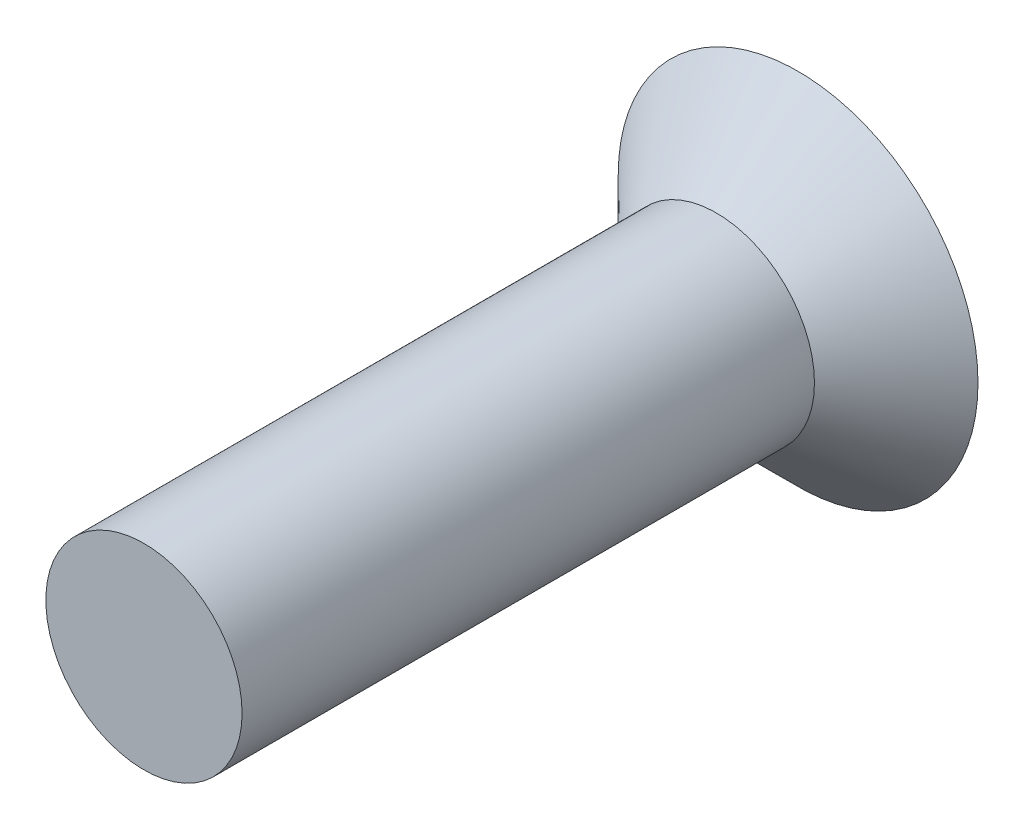
ISO-10303-21;
HEADER;
FILE_DESCRIPTION(('STEP AP214'),'2;1');
FILE_NAME('part.step','',(''),(''),'','','');
FILE_SCHEMA(('AUTOMOTIVE_DESIGN { 1 0 10303 214 1 1 1 1 }'));
ENDSEC;
DATA;
#1=APPLICATION_CONTEXT('core data for automotive mechanical design processes');
#2=APPLICATION_PROTOCOL_DEFINITION('international standard','automotive_design',2000,#1);
#3=PRODUCT_CONTEXT('',#1,'mechanical');
#4=PRODUCT('Part','Part','',(#3));
#5=PRODUCT_RELATED_PRODUCT_CATEGORY('part','',(#4));
#6=PRODUCT_DEFINITION_FORMATION('','',#4);
#7=PRODUCT_DEFINITION_CONTEXT('part definition',#1,'design');
#8=PRODUCT_DEFINITION('design','',#6,#7);
#9=PRODUCT_DEFINITION_SHAPE('','',#8);
#10=(LENGTH_UNIT() NAMED_UNIT(*) SI_UNIT(.MILLI.,.METRE.));
#11=(NAMED_UNIT(*) PLANE_ANGLE_UNIT() SI_UNIT($,.RADIAN.));
#12=(NAMED_UNIT(*) SI_UNIT($,.STERADIAN.) SOLID_ANGLE_UNIT());
#13=UNCERTAINTY_MEASURE_WITH_UNIT(LENGTH_MEASURE(1.E-05),#10,'distance_accuracy_value','');
#14=(GEOMETRIC_REPRESENTATION_CONTEXT(3) GLOBAL_UNCERTAINTY_ASSIGNED_CONTEXT((#13)) GLOBAL_UNIT_ASSIGNED_CONTEXT((#10,
#11,#12)) REPRESENTATION_CONTEXT('',''));
#15=CARTESIAN_POINT('',(0.,0.,0.));
#16=DIRECTION('',(0.,0.,1.));
#17=DIRECTION('',(1.,0.,0.));
#18=AXIS2_PLACEMENT_3D('',#15,#16,#17);
#19=CARTESIAN_POINT('',(0.,0.,10.));
#20=DIRECTION('',(0.,0.,-1.));
#21=DIRECTION('',(-1.,0.,0.));
#22=AXIS2_PLACEMENT_3D('',#19,#20,#21);
#23=CYLINDRICAL_SURFACE('',#22,1.5);
#24=CARTESIAN_POINT('',(0.,0.,10.));
#25=DIRECTION('',(0.,0.,1.));
#26=DIRECTION('',(1.,0.,0.));
#27=AXIS2_PLACEMENT_3D('',#24,#25,#26);
#28=CIRCLE('',#27,1.5);
#29=CARTESIAN_POINT('',(1.5,0.,10.));
#30=VERTEX_POINT('',#29);
#31=EDGE_CURVE('E10',#30,#30,#28,.T.);
#32=ORIENTED_EDGE('',*,*,#31,.F.);
#33=EDGE_LOOP('',(#32));
#34=FACE_BOUND('',#33,.T.);
#35=CARTESIAN_POINT('',(0.,0.,1.25));
#36=DIRECTION('',(0.,0.,1.));
#37=DIRECTION('',(1.,0.,0.));
#38=AXIS2_PLACEMENT_3D('',#35,#36,#37);
#39=CIRCLE('',#38,1.5);
#40=CARTESIAN_POINT('',(1.5,0.,1.25));
#41=VERTEX_POINT('',#40);
#42=EDGE_CURVE('E42',#41,#41,#39,.T.);
#43=ORIENTED_EDGE('',*,*,#42,.T.);
#44=EDGE_LOOP('',(#43));
#45=FACE_BOUND('',#44,.T.);
#46=ADVANCED_FACE('F36',(#34,#45),#23,.T.);
#47=CARTESIAN_POINT('',(0.,0.,10.));
#48=DIRECTION('',(0.,0.,1.));
#49=DIRECTION('',(1.,0.,0.));
#50=AXIS2_PLACEMENT_3D('',#47,#48,#49);
#51=PLANE('',#50);
#52=ORIENTED_EDGE('',*,*,#31,.T.);
#53=EDGE_LOOP('',(#52));
#54=FACE_BOUND('',#53,.T.);
#55=ADVANCED_FACE('F61',(#54),#51,.T.);
#56=CARTESIAN_POINT('',(0.,0.,0.));
#57=DIRECTION('',(0.,0.,-1.));
#58=DIRECTION('',(1.,0.,0.));
#59=AXIS2_PLACEMENT_3D('',#56,#57,#58);
#60=CONICAL_SURFACE('',#59,2.75,0.785398163397448);
#61=ORIENTED_EDGE('',*,*,#42,.F.);
#62=EDGE_LOOP('',(#61));
#63=FACE_BOUND('',#62,.T.);
#64=CARTESIAN_POINT('',(0.,0.,0.));
#65=DIRECTION('',(0.,0.,1.));
#66=DIRECTION('',(1.,0.,0.));
#67=AXIS2_PLACEMENT_3D('',#64,#65,#66);
#68=CIRCLE('',#67,2.75);
#69=CARTESIAN_POINT('',(2.75,0.,0.));
#70=VERTEX_POINT('',#69);
#71=EDGE_CURVE('E46',#70,#70,#68,.T.);
#72=ORIENTED_EDGE('',*,*,#71,.T.);
#73=EDGE_LOOP('',(#72));
#74=FACE_BOUND('',#73,.T.);
#75=ADVANCED_FACE('F53',(#63,#74),#60,.T.);
#76=CARTESIAN_POINT('',(0.,0.,0.));
#77=DIRECTION('',(0.,0.,1.));
#78=DIRECTION('',(1.,0.,0.));
#79=AXIS2_PLACEMENT_3D('',#76,#77,#78);
#80=PLANE('',#79);
#81=ORIENTED_EDGE('',*,*,#71,.F.);
#82=EDGE_LOOP('',(#81));
#83=FACE_BOUND('',#82,.T.);
#84=ADVANCED_FACE('F55',(#83),#80,.F.);
#85=CLOSED_SHELL('',(#46,#55,#75,#84));
#86=MANIFOLD_SOLID_BREP('B2',#85);
#87=ADVANCED_BREP_SHAPE_REPRESENTATION('',(#18,#86),#14);
#88=SHAPE_DEFINITION_REPRESENTATION(#9,#87);
ENDSEC;
END-ISO-10303-21;
